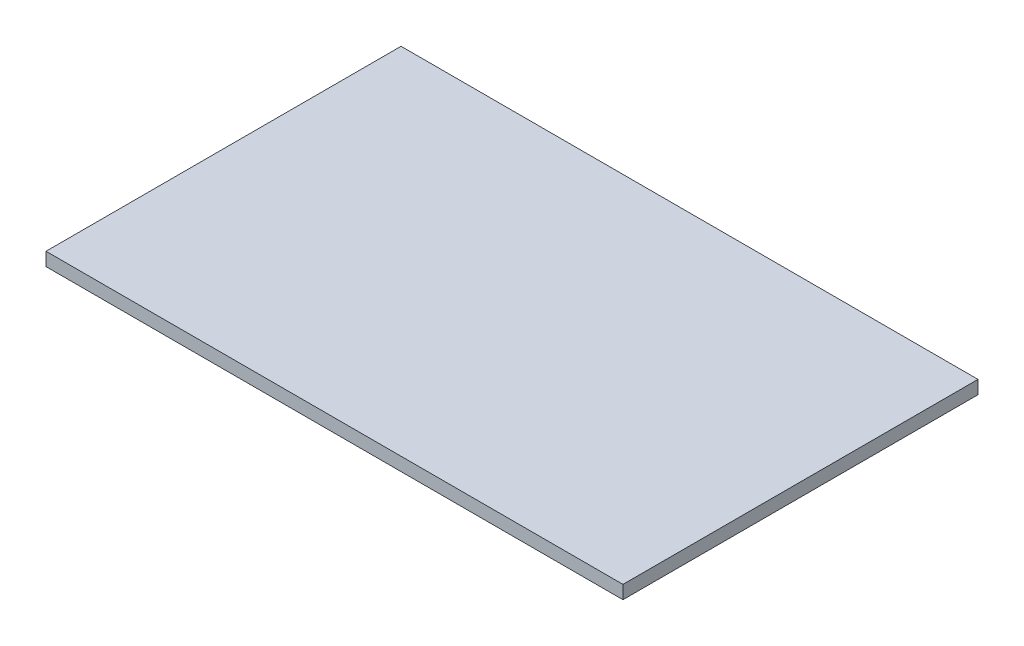
ISO-10303-21;
HEADER;
FILE_DESCRIPTION(('STEP AP214'),'2;1');
FILE_NAME('part.step','',(''),(''),'','','');
FILE_SCHEMA(('AUTOMOTIVE_DESIGN { 1 0 10303 214 1 1 1 1 }'));
ENDSEC;
DATA;
#1=APPLICATION_CONTEXT('core data for automotive mechanical design processes');
#2=APPLICATION_PROTOCOL_DEFINITION('international standard','automotive_design',2000,#1);
#3=PRODUCT_CONTEXT('',#1,'mechanical');
#4=PRODUCT('Part','Part','',(#3));
#5=PRODUCT_RELATED_PRODUCT_CATEGORY('part','',(#4));
#6=PRODUCT_DEFINITION_FORMATION('','',#4);
#7=PRODUCT_DEFINITION_CONTEXT('part definition',#1,'design');
#8=PRODUCT_DEFINITION('design','',#6,#7);
#9=PRODUCT_DEFINITION_SHAPE('','',#8);
#10=(LENGTH_UNIT() NAMED_UNIT(*) SI_UNIT(.MILLI.,.METRE.));
#11=(NAMED_UNIT(*) PLANE_ANGLE_UNIT() SI_UNIT($,.RADIAN.));
#12=(NAMED_UNIT(*) SI_UNIT($,.STERADIAN.) SOLID_ANGLE_UNIT());
#13=UNCERTAINTY_MEASURE_WITH_UNIT(LENGTH_MEASURE(1.E-05),#10,'distance_accuracy_value','');
#14=(GEOMETRIC_REPRESENTATION_CONTEXT(3) GLOBAL_UNCERTAINTY_ASSIGNED_CONTEXT((#13)) GLOBAL_UNIT_ASSIGNED_CONTEXT((#10,
#11,#12)) REPRESENTATION_CONTEXT('',''));
#15=CARTESIAN_POINT('',(0.,0.,0.));
#16=DIRECTION('',(0.,0.,1.));
#17=DIRECTION('',(1.,0.,0.));
#18=AXIS2_PLACEMENT_3D('',#15,#16,#17);
#19=CARTESIAN_POINT('',(65.,3.,-40.));
#20=DIRECTION('',(-1.,0.,0.));
#21=DIRECTION('',(0.,0.,1.));
#22=AXIS2_PLACEMENT_3D('',#19,#20,#21);
#23=PLANE('',#22);
#24=DIRECTION('',(0.,0.,-1.));
#25=VECTOR('',#24,1.);
#26=CARTESIAN_POINT('',(65.,0.,-40.));
#27=LINE('',#26,#25);
#28=CARTESIAN_POINT('',(65.,0.,40.));
#29=VERTEX_POINT('',#28);
#30=CARTESIAN_POINT('',(65.,0.,-40.));
#31=VERTEX_POINT('',#30);
#32=EDGE_CURVE('E107',#29,#31,#27,.T.);
#33=ORIENTED_EDGE('',*,*,#32,.T.);
#34=DIRECTION('',(0.,-1.,0.));
#35=VECTOR('',#34,1.);
#36=CARTESIAN_POINT('',(65.,3.,-40.));
#37=LINE('',#36,#35);
#38=CARTESIAN_POINT('',(65.,3.,-40.));
#39=VERTEX_POINT('',#38);
#40=EDGE_CURVE('E11',#39,#31,#37,.T.);
#41=ORIENTED_EDGE('',*,*,#40,.F.);
#42=DIRECTION('',(0.,0.,-1.));
#43=VECTOR('',#42,1.);
#44=CARTESIAN_POINT('',(65.,3.,-40.));
#45=LINE('',#44,#43);
#46=CARTESIAN_POINT('',(65.,3.,40.));
#47=VERTEX_POINT('',#46);
#48=EDGE_CURVE('E91',#47,#39,#45,.T.);
#49=ORIENTED_EDGE('',*,*,#48,.F.);
#50=DIRECTION('',(0.,-1.,0.));
#51=VECTOR('',#50,1.);
#52=CARTESIAN_POINT('',(65.,3.,40.));
#53=LINE('',#52,#51);
#54=EDGE_CURVE('E103',#47,#29,#53,.T.);
#55=ORIENTED_EDGE('',*,*,#54,.T.);
#56=EDGE_LOOP('',(#33,#41,#49,#55));
#57=FACE_BOUND('',#56,.T.);
#58=ADVANCED_FACE('F39',(#57),#23,.F.);
#59=CARTESIAN_POINT('',(-65.,3.,-40.));
#60=DIRECTION('',(0.,0.,1.));
#61=DIRECTION('',(1.,0.,0.));
#62=AXIS2_PLACEMENT_3D('',#59,#60,#61);
#63=PLANE('',#62);
#64=DIRECTION('',(-1.,0.,0.));
#65=VECTOR('',#64,1.);
#66=CARTESIAN_POINT('',(-65.,0.,-40.));
#67=LINE('',#66,#65);
#68=CARTESIAN_POINT('',(-65.,0.,-40.));
#69=VERTEX_POINT('',#68);
#70=EDGE_CURVE('E96',#31,#69,#67,.T.);
#71=ORIENTED_EDGE('',*,*,#70,.T.);
#72=DIRECTION('',(0.,-1.,0.));
#73=VECTOR('',#72,1.);
#74=CARTESIAN_POINT('',(-65.,3.,-40.));
#75=LINE('',#74,#73);
#76=CARTESIAN_POINT('',(-65.,3.,-40.));
#77=VERTEX_POINT('',#76);
#78=EDGE_CURVE('E48',#77,#69,#75,.T.);
#79=ORIENTED_EDGE('',*,*,#78,.F.);
#80=DIRECTION('',(-1.,0.,0.));
#81=VECTOR('',#80,1.);
#82=CARTESIAN_POINT('',(-65.,3.,-40.));
#83=LINE('',#82,#81);
#84=EDGE_CURVE('E86',#39,#77,#83,.T.);
#85=ORIENTED_EDGE('',*,*,#84,.F.);
#86=ORIENTED_EDGE('',*,*,#40,.T.);
#87=EDGE_LOOP('',(#71,#79,#85,#86));
#88=FACE_BOUND('',#87,.T.);
#89=ADVANCED_FACE('F95',(#88),#63,.F.);
#90=CARTESIAN_POINT('',(-65.,3.,-40.));
#91=DIRECTION('',(1.,0.,0.));
#92=DIRECTION('',(0.,0.,-1.));
#93=AXIS2_PLACEMENT_3D('',#90,#91,#92);
#94=PLANE('',#93);
#95=DIRECTION('',(0.,0.,1.));
#96=VECTOR('',#95,1.);
#97=CARTESIAN_POINT('',(-65.,0.,-40.));
#98=LINE('',#97,#96);
#99=CARTESIAN_POINT('',(-65.,0.,40.));
#100=VERTEX_POINT('',#99);
#101=EDGE_CURVE('E73',#69,#100,#98,.T.);
#102=ORIENTED_EDGE('',*,*,#101,.T.);
#103=DIRECTION('',(0.,-1.,0.));
#104=VECTOR('',#103,1.);
#105=CARTESIAN_POINT('',(-65.,3.,40.));
#106=LINE('',#105,#104);
#107=CARTESIAN_POINT('',(-65.,3.,40.));
#108=VERTEX_POINT('',#107);
#109=EDGE_CURVE('E98',#108,#100,#106,.T.);
#110=ORIENTED_EDGE('',*,*,#109,.F.);
#111=DIRECTION('',(0.,0.,1.));
#112=VECTOR('',#111,1.);
#113=CARTESIAN_POINT('',(-65.,3.,-40.));
#114=LINE('',#113,#112);
#115=EDGE_CURVE('E89',#77,#108,#114,.T.);
#116=ORIENTED_EDGE('',*,*,#115,.F.);
#117=ORIENTED_EDGE('',*,*,#78,.T.);
#118=EDGE_LOOP('',(#102,#110,#116,#117));
#119=FACE_BOUND('',#118,.T.);
#120=ADVANCED_FACE('F99',(#119),#94,.F.);
#121=CARTESIAN_POINT('',(-65.,3.,40.));
#122=DIRECTION('',(0.,0.,-1.));
#123=DIRECTION('',(-1.,0.,0.));
#124=AXIS2_PLACEMENT_3D('',#121,#122,#123);
#125=PLANE('',#124);
#126=DIRECTION('',(1.,0.,0.));
#127=VECTOR('',#126,1.);
#128=CARTESIAN_POINT('',(-65.,0.,40.));
#129=LINE('',#128,#127);
#130=EDGE_CURVE('E79',#100,#29,#129,.T.);
#131=ORIENTED_EDGE('',*,*,#130,.T.);
#132=ORIENTED_EDGE('',*,*,#54,.F.);
#133=DIRECTION('',(1.,0.,0.));
#134=VECTOR('',#133,1.);
#135=CARTESIAN_POINT('',(-65.,3.,40.));
#136=LINE('',#135,#134);
#137=EDGE_CURVE('E56',#108,#47,#136,.T.);
#138=ORIENTED_EDGE('',*,*,#137,.F.);
#139=ORIENTED_EDGE('',*,*,#109,.T.);
#140=EDGE_LOOP('',(#131,#132,#138,#139));
#141=FACE_BOUND('',#140,.T.);
#142=ADVANCED_FACE('F120',(#141),#125,.F.);
#143=CARTESIAN_POINT('',(0.,3.,0.));
#144=DIRECTION('',(0.,1.,0.));
#145=DIRECTION('',(0.,0.,1.));
#146=AXIS2_PLACEMENT_3D('',#143,#144,#145);
#147=PLANE('',#146);
#148=ORIENTED_EDGE('',*,*,#48,.T.);
#149=ORIENTED_EDGE('',*,*,#84,.T.);
#150=ORIENTED_EDGE('',*,*,#115,.T.);
#151=ORIENTED_EDGE('',*,*,#137,.T.);
#152=EDGE_LOOP('',(#148,#149,#150,#151));
#153=FACE_BOUND('',#152,.T.);
#154=ADVANCED_FACE('F87',(#153),#147,.T.);
#155=CARTESIAN_POINT('',(0.,0.,0.));
#156=DIRECTION('',(0.,1.,0.));
#157=DIRECTION('',(0.,0.,1.));
#158=AXIS2_PLACEMENT_3D('',#155,#156,#157);
#159=PLANE('',#158);
#160=ORIENTED_EDGE('',*,*,#32,.F.);
#161=ORIENTED_EDGE('',*,*,#130,.F.);
#162=ORIENTED_EDGE('',*,*,#101,.F.);
#163=ORIENTED_EDGE('',*,*,#70,.F.);
#164=EDGE_LOOP('',(#160,#161,#162,#163));
#165=FACE_BOUND('',#164,.T.);
#166=ADVANCED_FACE('F123',(#165),#159,.F.);
#167=CLOSED_SHELL('',(#58,#89,#120,#142,#154,#166));
#168=MANIFOLD_SOLID_BREP('B2',#167);
#169=ADVANCED_BREP_SHAPE_REPRESENTATION('',(#18,#168),#14);
#170=SHAPE_DEFINITION_REPRESENTATION(#9,#169);
ENDSEC;
END-ISO-10303-21;
